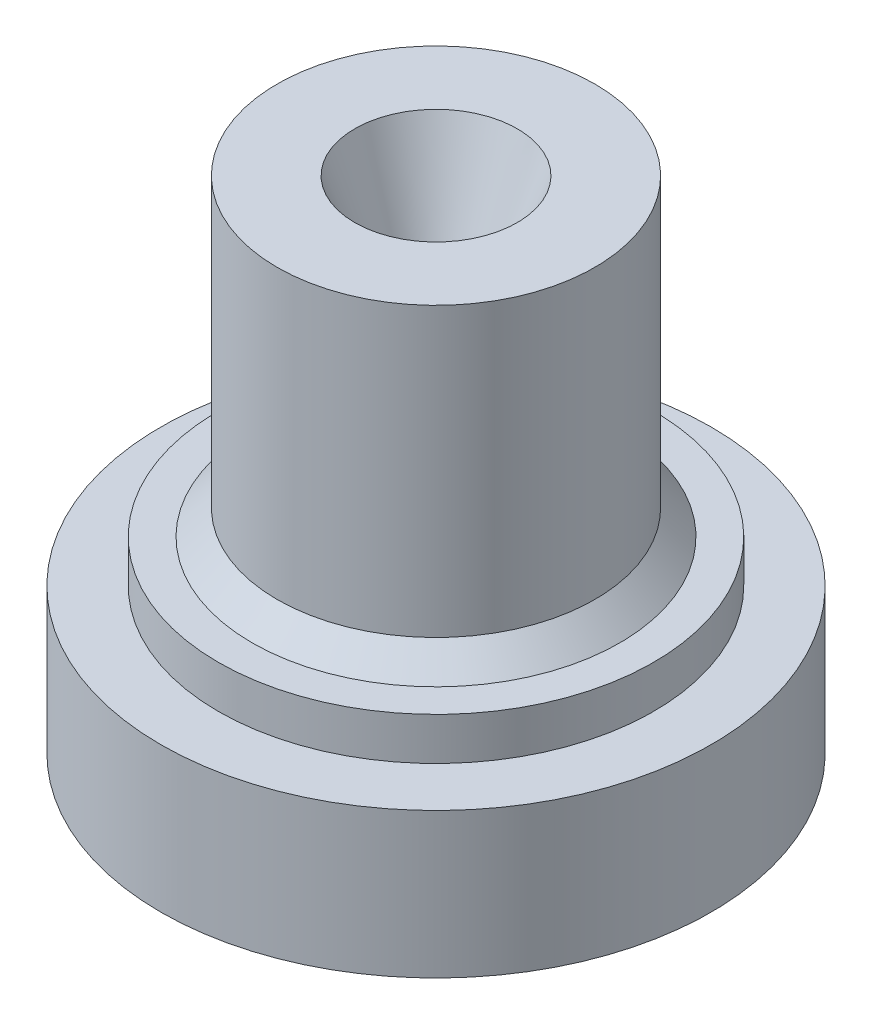
ISO-10303-21;
HEADER;
FILE_DESCRIPTION(('STEP AP214'),'2;1');
FILE_NAME('part.step','',(''),(''),'','','');
FILE_SCHEMA(('AUTOMOTIVE_DESIGN { 1 0 10303 214 1 1 1 1 }'));
ENDSEC;
DATA;
#1=APPLICATION_CONTEXT('core data for automotive mechanical design processes');
#2=APPLICATION_PROTOCOL_DEFINITION('international standard','automotive_design',2000,#1);
#3=PRODUCT_CONTEXT('',#1,'mechanical');
#4=PRODUCT('Part','Part','',(#3));
#5=PRODUCT_RELATED_PRODUCT_CATEGORY('part','',(#4));
#6=PRODUCT_DEFINITION_FORMATION('','',#4);
#7=PRODUCT_DEFINITION_CONTEXT('part definition',#1,'design');
#8=PRODUCT_DEFINITION('design','',#6,#7);
#9=PRODUCT_DEFINITION_SHAPE('','',#8);
#10=(LENGTH_UNIT() NAMED_UNIT(*) SI_UNIT(.MILLI.,.METRE.));
#11=(NAMED_UNIT(*) PLANE_ANGLE_UNIT() SI_UNIT($,.RADIAN.));
#12=(NAMED_UNIT(*) SI_UNIT($,.STERADIAN.) SOLID_ANGLE_UNIT());
#13=UNCERTAINTY_MEASURE_WITH_UNIT(LENGTH_MEASURE(1.E-05),#10,'distance_accuracy_value','');
#14=(GEOMETRIC_REPRESENTATION_CONTEXT(3) GLOBAL_UNCERTAINTY_ASSIGNED_CONTEXT((#13)) GLOBAL_UNIT_ASSIGNED_CONTEXT((#10,
#11,#12)) REPRESENTATION_CONTEXT('',''));
#15=CARTESIAN_POINT('',(0.,0.,0.));
#16=DIRECTION('',(0.,0.,1.));
#17=DIRECTION('',(1.,0.,0.));
#18=AXIS2_PLACEMENT_3D('',#15,#16,#17);
#19=CARTESIAN_POINT('',(0.,5.8,0.));
#20=DIRECTION('',(0.,-1.,0.));
#21=DIRECTION('',(0.,0.,-1.));
#22=AXIS2_PLACEMENT_3D('',#19,#20,#21);
#23=CYLINDRICAL_SURFACE('',#22,11.);
#24=CARTESIAN_POINT('',(0.,5.8,0.));
#25=DIRECTION('',(0.,1.,0.));
#26=DIRECTION('',(0.,0.,1.));
#27=AXIS2_PLACEMENT_3D('',#24,#25,#26);
#28=CIRCLE('',#27,11.);
#29=CARTESIAN_POINT('',(0.,5.8,11.));
#30=VERTEX_POINT('',#29);
#31=EDGE_CURVE('E44',#30,#30,#28,.T.);
#32=ORIENTED_EDGE('',*,*,#31,.F.);
#33=EDGE_LOOP('',(#32));
#34=FACE_BOUND('',#33,.T.);
#35=CARTESIAN_POINT('',(0.,0.,0.));
#36=DIRECTION('',(0.,1.,0.));
#37=DIRECTION('',(0.,0.,1.));
#38=AXIS2_PLACEMENT_3D('',#35,#36,#37);
#39=CIRCLE('',#38,11.);
#40=CARTESIAN_POINT('',(0.,0.,11.));
#41=VERTEX_POINT('',#40);
#42=EDGE_CURVE('E67',#41,#41,#39,.T.);
#43=ORIENTED_EDGE('',*,*,#42,.T.);
#44=EDGE_LOOP('',(#43));
#45=FACE_BOUND('',#44,.T.);
#46=ADVANCED_FACE('F31',(#34,#45),#23,.T.);
#47=CARTESIAN_POINT('',(0.,5.8,0.));
#48=DIRECTION('',(0.,1.,0.));
#49=DIRECTION('',(0.,0.,1.));
#50=AXIS2_PLACEMENT_3D('',#47,#48,#49);
#51=PLANE('',#50);
#52=CARTESIAN_POINT('',(0.,5.8,0.));
#53=DIRECTION('',(0.,1.,0.));
#54=DIRECTION('',(0.,0.,1.));
#55=AXIS2_PLACEMENT_3D('',#52,#53,#54);
#56=CIRCLE('',#55,8.7);
#57=CARTESIAN_POINT('',(0.,5.8,8.7));
#58=VERTEX_POINT('',#57);
#59=EDGE_CURVE('E54',#58,#58,#56,.T.);
#60=ORIENTED_EDGE('',*,*,#59,.F.);
#61=EDGE_LOOP('',(#60));
#62=FACE_BOUND('',#61,.T.);
#63=ORIENTED_EDGE('',*,*,#31,.T.);
#64=EDGE_LOOP('',(#63));
#65=FACE_BOUND('',#64,.T.);
#66=ADVANCED_FACE('F78',(#62,#65),#51,.T.);
#67=CARTESIAN_POINT('',(0.,0.,0.));
#68=DIRECTION('',(0.,1.,0.));
#69=DIRECTION('',(0.,0.,1.));
#70=AXIS2_PLACEMENT_3D('',#67,#68,#69);
#71=PLANE('',#70);
#72=CARTESIAN_POINT('',(0.,0.,0.));
#73=DIRECTION('',(0.,-1.,0.));
#74=DIRECTION('',(0.,0.,-1.));
#75=AXIS2_PLACEMENT_3D('',#72,#73,#74);
#76=CIRCLE('',#75,10.);
#77=CARTESIAN_POINT('',(0.,0.,-10.));
#78=VERTEX_POINT('',#77);
#79=EDGE_CURVE('E61',#78,#78,#76,.T.);
#80=ORIENTED_EDGE('',*,*,#79,.F.);
#81=EDGE_LOOP('',(#80));
#82=FACE_BOUND('',#81,.T.);
#83=ORIENTED_EDGE('',*,*,#42,.F.);
#84=EDGE_LOOP('',(#83));
#85=FACE_BOUND('',#84,.T.);
#86=ADVANCED_FACE('F75',(#82,#85),#71,.F.);
#87=CARTESIAN_POINT('',(0.,7.5,0.));
#88=DIRECTION('',(0.,-1.,0.));
#89=DIRECTION('',(0.,0.,-1.));
#90=AXIS2_PLACEMENT_3D('',#87,#88,#89);
#91=CYLINDRICAL_SURFACE('',#90,8.7);
#92=CARTESIAN_POINT('',(0.,7.5,0.));
#93=DIRECTION('',(0.,1.,0.));
#94=DIRECTION('',(0.,0.,1.));
#95=AXIS2_PLACEMENT_3D('',#92,#93,#94);
#96=CIRCLE('',#95,8.7);
#97=CARTESIAN_POINT('',(0.,7.5,8.7));
#98=VERTEX_POINT('',#97);
#99=EDGE_CURVE('E64',#98,#98,#96,.T.);
#100=ORIENTED_EDGE('',*,*,#99,.F.);
#101=EDGE_LOOP('',(#100));
#102=FACE_BOUND('',#101,.T.);
#103=ORIENTED_EDGE('',*,*,#59,.T.);
#104=EDGE_LOOP('',(#103));
#105=FACE_BOUND('',#104,.T.);
#106=ADVANCED_FACE('F77',(#102,#105),#91,.T.);
#107=CARTESIAN_POINT('',(0.,7.5,0.));
#108=DIRECTION('',(0.,1.,0.));
#109=DIRECTION('',(0.,0.,1.));
#110=AXIS2_PLACEMENT_3D('',#107,#108,#109);
#111=PLANE('',#110);
#112=CARTESIAN_POINT('',(0.,7.5,0.));
#113=DIRECTION('',(0.,1.,0.));
#114=DIRECTION('',(0.,0.,1.));
#115=AXIS2_PLACEMENT_3D('',#112,#113,#114);
#116=CIRCLE('',#115,7.35);
#117=CARTESIAN_POINT('',(0.,7.5,7.35));
#118=VERTEX_POINT('',#117);
#119=EDGE_CURVE('E10',#118,#118,#116,.F.);
#120=ORIENTED_EDGE('',*,*,#119,.T.);
#121=EDGE_LOOP('',(#120));
#122=FACE_BOUND('',#121,.T.);
#123=ORIENTED_EDGE('',*,*,#99,.T.);
#124=EDGE_LOOP('',(#123));
#125=FACE_BOUND('',#124,.T.);
#126=ADVANCED_FACE('F85',(#122,#125),#111,.T.);
#127=CARTESIAN_POINT('',(0.,20.,0.));
#128=DIRECTION('',(0.,-1.,0.));
#129=DIRECTION('',(0.,0.,-1.));
#130=AXIS2_PLACEMENT_3D('',#127,#128,#129);
#131=CYLINDRICAL_SURFACE('',#130,6.35);
#132=CARTESIAN_POINT('',(0.,8.50000000000001,0.));
#133=DIRECTION('',(0.,1.,0.));
#134=DIRECTION('',(0.,0.,1.));
#135=AXIS2_PLACEMENT_3D('',#132,#133,#134);
#136=CIRCLE('',#135,6.35);
#137=CARTESIAN_POINT('',(0.,8.50000000000001,6.35));
#138=VERTEX_POINT('',#137);
#139=EDGE_CURVE('E39',#138,#138,#136,.T.);
#140=ORIENTED_EDGE('',*,*,#139,.T.);
#141=EDGE_LOOP('',(#140));
#142=FACE_BOUND('',#141,.T.);
#143=CARTESIAN_POINT('',(0.,20.,0.));
#144=DIRECTION('',(0.,1.,0.));
#145=DIRECTION('',(0.,0.,1.));
#146=AXIS2_PLACEMENT_3D('',#143,#144,#145);
#147=CIRCLE('',#146,6.35);
#148=CARTESIAN_POINT('',(0.,20.,6.35));
#149=VERTEX_POINT('',#148);
#150=EDGE_CURVE('E49',#149,#149,#147,.T.);
#151=ORIENTED_EDGE('',*,*,#150,.F.);
#152=EDGE_LOOP('',(#151));
#153=FACE_BOUND('',#152,.T.);
#154=ADVANCED_FACE('F117',(#142,#153),#131,.T.);
#155=CARTESIAN_POINT('',(0.,20.,0.));
#156=DIRECTION('',(0.,1.,0.));
#157=DIRECTION('',(0.,0.,1.));
#158=AXIS2_PLACEMENT_3D('',#155,#156,#157);
#159=PLANE('',#158);
#160=CARTESIAN_POINT('',(0.,20.,0.));
#161=DIRECTION('',(0.,1.,0.));
#162=DIRECTION('',(0.,0.,1.));
#163=AXIS2_PLACEMENT_3D('',#160,#161,#162);
#164=CIRCLE('',#163,3.25);
#165=CARTESIAN_POINT('',(0.,20.,3.25));
#166=VERTEX_POINT('',#165);
#167=EDGE_CURVE('E50',#166,#166,#164,.T.);
#168=ORIENTED_EDGE('',*,*,#167,.F.);
#169=EDGE_LOOP('',(#168));
#170=FACE_BOUND('',#169,.T.);
#171=ORIENTED_EDGE('',*,*,#150,.T.);
#172=EDGE_LOOP('',(#171));
#173=FACE_BOUND('',#172,.T.);
#174=ADVANCED_FACE('F126',(#170,#173),#159,.T.);
#175=CARTESIAN_POINT('',(0.,8.50000000000001,0.));
#176=DIRECTION('',(0.,-1.,0.));
#177=DIRECTION('',(0.,0.,-1.));
#178=AXIS2_PLACEMENT_3D('',#175,#176,#177);
#179=CONICAL_SURFACE('',#178,6.35,0.785398163397443);
#180=ORIENTED_EDGE('',*,*,#119,.F.);
#181=EDGE_LOOP('',(#180));
#182=FACE_BOUND('',#181,.T.);
#183=ORIENTED_EDGE('',*,*,#139,.F.);
#184=EDGE_LOOP('',(#183));
#185=FACE_BOUND('',#184,.T.);
#186=ADVANCED_FACE('F33',(#182,#185),#179,.T.);
#187=CARTESIAN_POINT('',(0.,0.,0.));
#188=DIRECTION('',(0.,1.,0.));
#189=DIRECTION('',(0.,0.,1.));
#190=AXIS2_PLACEMENT_3D('',#187,#188,#189);
#191=CYLINDRICAL_SURFACE('',#190,1.25);
#192=CARTESIAN_POINT('',(0.,8.74999999999997,0.));
#193=DIRECTION('',(0.,-1.,0.));
#194=DIRECTION('',(0.,0.,-1.));
#195=AXIS2_PLACEMENT_3D('',#192,#193,#194);
#196=CIRCLE('',#195,1.25);
#197=CARTESIAN_POINT('',(0.,8.74999999999997,-1.25));
#198=VERTEX_POINT('',#197);
#199=EDGE_CURVE('E35',#198,#198,#196,.T.);
#200=ORIENTED_EDGE('',*,*,#199,.T.);
#201=EDGE_LOOP('',(#200));
#202=FACE_BOUND('',#201,.T.);
#203=CARTESIAN_POINT('',(0.,14.5050451610908,0.));
#204=DIRECTION('',(0.,1.,0.));
#205=DIRECTION('',(0.,0.,1.));
#206=AXIS2_PLACEMENT_3D('',#203,#204,#205);
#207=CIRCLE('',#206,1.25);
#208=CARTESIAN_POINT('',(0.,14.5050451610908,1.25));
#209=VERTEX_POINT('',#208);
#210=EDGE_CURVE('E47',#209,#209,#207,.T.);
#211=ORIENTED_EDGE('',*,*,#210,.T.);
#212=EDGE_LOOP('',(#211));
#213=FACE_BOUND('',#212,.T.);
#214=ADVANCED_FACE('F138',(#202,#213),#191,.F.);
#215=CARTESIAN_POINT('',(0.,20.,0.));
#216=DIRECTION('',(0.,1.,0.));
#217=DIRECTION('',(0.,0.,1.));
#218=AXIS2_PLACEMENT_3D('',#215,#216,#217);
#219=CONICAL_SURFACE('',#218,3.25,0.349065850398867);
#220=ORIENTED_EDGE('',*,*,#167,.T.);
#221=EDGE_LOOP('',(#220));
#222=FACE_BOUND('',#221,.T.);
#223=ORIENTED_EDGE('',*,*,#210,.F.);
#224=EDGE_LOOP('',(#223));
#225=FACE_BOUND('',#224,.T.);
#226=ADVANCED_FACE('F152',(#222,#225),#219,.F.);
#227=CARTESIAN_POINT('',(0.,0.,0.));
#228=DIRECTION('',(0.,-1.,0.));
#229=DIRECTION('',(0.,0.,-1.));
#230=AXIS2_PLACEMENT_3D('',#227,#228,#229);
#231=CONICAL_SURFACE('',#230,10.,0.78539816339745);
#232=CARTESIAN_POINT('',(0.,0.,-10.));
#233=CARTESIAN_POINT('',(0.,0.0911458333333334,-9.90885416666667));
#234=CARTESIAN_POINT('',(0.,0.182291666666666,-9.81770833333333));
#235=CARTESIAN_POINT('',(0.,0.364583333333332,-9.63541666666667));
#236=CARTESIAN_POINT('',(0.,0.455729166666665,-9.54427083333333));
#237=CARTESIAN_POINT('',(0.,0.638020833333331,-9.36197916666667));
#238=CARTESIAN_POINT('',(0.,0.729166666666665,-9.27083333333333));
#239=CARTESIAN_POINT('',(0.,0.911458333333331,-9.08854166666667));
#240=CARTESIAN_POINT('',(0.,1.00260416666666,-8.99739583333333));
#241=CARTESIAN_POINT('',(0.,1.18489583333333,-8.81510416666667));
#242=CARTESIAN_POINT('',(0.,1.27604166666666,-8.72395833333333));
#243=CARTESIAN_POINT('',(0.,1.45833333333333,-8.54166666666667));
#244=CARTESIAN_POINT('',(0.,1.54947916666666,-8.45052083333333));
#245=CARTESIAN_POINT('',(0.,1.73177083333333,-8.26822916666666));
#246=CARTESIAN_POINT('',(0.,1.82291666666666,-8.17708333333333));
#247=CARTESIAN_POINT('',(0.,2.00520833333333,-7.99479166666667));
#248=CARTESIAN_POINT('',(0.,2.09635416666666,-7.90364583333333));
#249=CARTESIAN_POINT('',(0.,2.27864583333333,-7.72135416666667));
#250=CARTESIAN_POINT('',(0.,2.36979166666666,-7.63020833333333));
#251=CARTESIAN_POINT('',(0.,2.55208333333333,-7.44791666666667));
#252=CARTESIAN_POINT('',(0.,2.64322916666666,-7.35677083333333));
#253=CARTESIAN_POINT('',(0.,2.82552083333333,-7.17447916666667));
#254=CARTESIAN_POINT('',(0.,2.91666666666666,-7.08333333333333));
#255=CARTESIAN_POINT('',(0.,3.09895833333332,-6.90104166666666));
#256=CARTESIAN_POINT('',(0.,3.19010416666666,-6.80989583333333));
#257=CARTESIAN_POINT('',(0.,3.37239583333332,-6.62760416666667));
#258=CARTESIAN_POINT('',(0.,3.46354166666666,-6.53645833333333));
#259=CARTESIAN_POINT('',(0.,3.64583333333332,-6.35416666666666));
#260=CARTESIAN_POINT('',(0.,3.73697916666666,-6.26302083333333));
#261=CARTESIAN_POINT('',(0.,3.91927083333332,-6.08072916666667));
#262=CARTESIAN_POINT('',(0.,4.01041666666665,-5.98958333333333));
#263=CARTESIAN_POINT('',(0.,4.19270833333332,-5.80729166666666));
#264=CARTESIAN_POINT('',(0.,4.28385416666665,-5.71614583333333));
#265=CARTESIAN_POINT('',(0.,4.46614583333332,-5.53385416666666));
#266=CARTESIAN_POINT('',(0.,4.55729166666665,-5.44270833333333));
#267=CARTESIAN_POINT('',(0.,4.73958333333332,-5.26041666666666));
#268=CARTESIAN_POINT('',(0.,4.83072916666665,-5.16927083333333));
#269=CARTESIAN_POINT('',(0.,5.01302083333332,-4.98697916666666));
#270=CARTESIAN_POINT('',(0.,5.10416666666665,-4.89583333333333));
#271=CARTESIAN_POINT('',(0.,5.28645833333332,-4.71354166666666));
#272=CARTESIAN_POINT('',(0.,5.37760416666665,-4.62239583333333));
#273=CARTESIAN_POINT('',(0.,5.55989583333332,-4.44010416666666));
#274=CARTESIAN_POINT('',(0.,5.65104166666665,-4.34895833333333));
#275=CARTESIAN_POINT('',(0.,5.83333333333332,-4.16666666666666));
#276=CARTESIAN_POINT('',(0.,5.92447916666665,-4.07552083333333));
#277=CARTESIAN_POINT('',(0.,6.10677083333331,-3.89322916666666));
#278=CARTESIAN_POINT('',(0.,6.19791666666665,-3.80208333333333));
#279=CARTESIAN_POINT('',(0.,6.38020833333331,-3.61979166666666));
#280=CARTESIAN_POINT('',(0.,6.47135416666665,-3.52864583333333));
#281=CARTESIAN_POINT('',(0.,6.65364583333331,-3.34635416666666));
#282=CARTESIAN_POINT('',(0.,6.74479166666665,-3.25520833333333));
#283=CARTESIAN_POINT('',(0.,6.92708333333331,-3.07291666666666));
#284=CARTESIAN_POINT('',(0.,7.01822916666665,-2.98177083333333));
#285=CARTESIAN_POINT('',(0.,7.20052083333331,-2.79947916666666));
#286=CARTESIAN_POINT('',(0.,7.29166666666664,-2.70833333333333));
#287=CARTESIAN_POINT('',(0.,7.47395833333331,-2.52604166666666));
#288=CARTESIAN_POINT('',(0.,7.56510416666664,-2.43489583333333));
#289=CARTESIAN_POINT('',(0.,7.74739583333331,-2.25260416666666));
#290=CARTESIAN_POINT('',(0.,7.83854166666664,-2.16145833333333));
#291=CARTESIAN_POINT('',(0.,8.02083333333331,-1.97916666666666));
#292=CARTESIAN_POINT('',(0.,8.11197916666664,-1.88802083333333));
#293=CARTESIAN_POINT('',(0.,8.29427083333331,-1.70572916666666));
#294=CARTESIAN_POINT('',(0.,8.38541666666664,-1.61458333333333));
#295=CARTESIAN_POINT('',(0.,8.56770833333331,-1.43229166666666));
#296=CARTESIAN_POINT('',(0.,8.65885416666664,-1.34114583333333));
#297=CARTESIAN_POINT('',(0.,8.74999999999997,-1.25));
#298=B_SPLINE_CURVE_WITH_KNOTS('',3,(#232,#233,#234,#235,#236,#237,#238,#239,#240,#241,#242,
#243,#244,#245,#246,#247,#248,#249,#250,#251,#252,#253,#254,#255,#256,#257,#258,#259,#260,#261,
#262,#263,#264,#265,#266,#267,#268,#269,#270,#271,#272,#273,#274,#275,#276,#277,#278,#279,#280,
#281,#282,#283,#284,#285,#286,#287,#288,#289,#290,#291,#292,#293,#294,#295,#296,#297),
.UNSPECIFIED.,.F.,.F.,(4,2,2,2,2,2,2,2,2,2,2,2,2,2,2,2,2,2,2,2,2,2,2,2,2,2,2,2,2,2,2,2,4),(0.,
0.386699020961392,0.773398041922786,1.16009706288418,1.54679608384557,1.93349510480696,
2.32019412576836,2.70689314672975,3.09359216769114,3.48029118865253,3.86699020961393,
4.25368923057532,4.64038825153671,5.0270872724981,5.4137862934595,5.80048531442089,
6.18718433538228,6.57388335634368,6.96058237730507,7.34728139826646,7.73398041922785,
8.12067944018925,8.50737846115064,8.89407748211203,9.28077650307342,9.66747552403482,
10.0541745449962,10.4408735659576,10.827572586919,11.2142716078804,11.6009706288418,
11.9876696498032,12.3743686707646),.UNSPECIFIED.);
#299=EDGE_CURVE('BSEAM156',#78,#198,#298,.T.);
#300=ORIENTED_EDGE('',*,*,#79,.T.);
#301=ORIENTED_EDGE('',*,*,#199,.F.);
#302=ORIENTED_EDGE('',*,*,#299,.T.);
#303=ORIENTED_EDGE('',*,*,#299,.F.);
#304=EDGE_LOOP('',(#300,#302,#301,#303));
#305=FACE_BOUND('',#304,.T.);
#306=ADVANCED_FACE('F156',(#305),#231,.F.);
#307=CLOSED_SHELL('',(#46,#66,#86,#106,#126,#154,#174,#186,#214,#226,#306));
#308=MANIFOLD_SOLID_BREP('B2',#307);
#309=ADVANCED_BREP_SHAPE_REPRESENTATION('',(#18,#308),#14);
#310=SHAPE_DEFINITION_REPRESENTATION(#9,#309);
ENDSEC;
END-ISO-10303-21;
